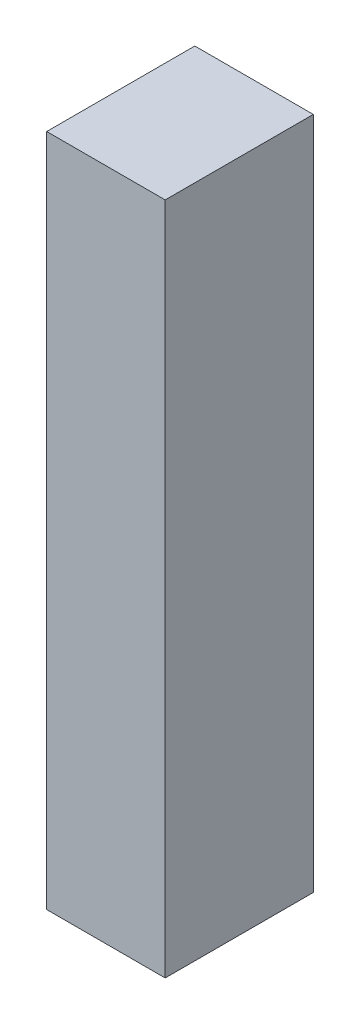
ISO-10303-21;
HEADER;
FILE_DESCRIPTION(('STEP AP214'),'2;1');
FILE_NAME('part.step','',(''),(''),'','','');
FILE_SCHEMA(('AUTOMOTIVE_DESIGN { 1 0 10303 214 1 1 1 1 }'));
ENDSEC;
DATA;
#1=APPLICATION_CONTEXT('core data for automotive mechanical design processes');
#2=APPLICATION_PROTOCOL_DEFINITION('international standard','automotive_design',2000,#1);
#3=PRODUCT_CONTEXT('',#1,'mechanical');
#4=PRODUCT('Part','Part','',(#3));
#5=PRODUCT_RELATED_PRODUCT_CATEGORY('part','',(#4));
#6=PRODUCT_DEFINITION_FORMATION('','',#4);
#7=PRODUCT_DEFINITION_CONTEXT('part definition',#1,'design');
#8=PRODUCT_DEFINITION('design','',#6,#7);
#9=PRODUCT_DEFINITION_SHAPE('','',#8);
#10=(LENGTH_UNIT() NAMED_UNIT(*) SI_UNIT(.MILLI.,.METRE.));
#11=(NAMED_UNIT(*) PLANE_ANGLE_UNIT() SI_UNIT($,.RADIAN.));
#12=(NAMED_UNIT(*) SI_UNIT($,.STERADIAN.) SOLID_ANGLE_UNIT());
#13=UNCERTAINTY_MEASURE_WITH_UNIT(LENGTH_MEASURE(1.E-05),#10,'distance_accuracy_value','');
#14=(GEOMETRIC_REPRESENTATION_CONTEXT(3) GLOBAL_UNCERTAINTY_ASSIGNED_CONTEXT((#13)) GLOBAL_UNIT_ASSIGNED_CONTEXT((#10,
#11,#12)) REPRESENTATION_CONTEXT('',''));
#15=CARTESIAN_POINT('',(0.,0.,0.));
#16=DIRECTION('',(0.,0.,1.));
#17=DIRECTION('',(1.,0.,0.));
#18=AXIS2_PLACEMENT_3D('',#15,#16,#17);
#19=CARTESIAN_POINT('',(8.,-45.5,20.));
#20=DIRECTION('',(-1.,0.,0.));
#21=DIRECTION('',(0.,0.,1.));
#22=AXIS2_PLACEMENT_3D('',#19,#20,#21);
#23=PLANE('',#22);
#24=DIRECTION('',(0.,1.,0.));
#25=VECTOR('',#24,1.);
#26=CARTESIAN_POINT('',(8.,-45.5,0.));
#27=LINE('',#26,#25);
#28=CARTESIAN_POINT('',(8.,-45.5,0.));
#29=VERTEX_POINT('',#28);
#30=CARTESIAN_POINT('',(8.,45.5,0.));
#31=VERTEX_POINT('',#30);
#32=EDGE_CURVE('E96',#29,#31,#27,.T.);
#33=ORIENTED_EDGE('',*,*,#32,.T.);
#34=DIRECTION('',(0.,0.,-1.));
#35=VECTOR('',#34,1.);
#36=CARTESIAN_POINT('',(8.,45.5,20.));
#37=LINE('',#36,#35);
#38=CARTESIAN_POINT('',(8.,45.5,20.));
#39=VERTEX_POINT('',#38);
#40=EDGE_CURVE('E11',#39,#31,#37,.T.);
#41=ORIENTED_EDGE('',*,*,#40,.F.);
#42=DIRECTION('',(0.,1.,0.));
#43=VECTOR('',#42,1.);
#44=CARTESIAN_POINT('',(8.,-45.5,20.));
#45=LINE('',#44,#43);
#46=CARTESIAN_POINT('',(8.,-45.5,20.));
#47=VERTEX_POINT('',#46);
#48=EDGE_CURVE('E84',#47,#39,#45,.T.);
#49=ORIENTED_EDGE('',*,*,#48,.F.);
#50=DIRECTION('',(0.,0.,-1.));
#51=VECTOR('',#50,1.);
#52=CARTESIAN_POINT('',(8.,-45.5,20.));
#53=LINE('',#52,#51);
#54=EDGE_CURVE('E92',#47,#29,#53,.T.);
#55=ORIENTED_EDGE('',*,*,#54,.T.);
#56=EDGE_LOOP('',(#33,#41,#49,#55));
#57=FACE_BOUND('',#56,.T.);
#58=ADVANCED_FACE('F33',(#57),#23,.F.);
#59=CARTESIAN_POINT('',(-8.,45.5,20.));
#60=DIRECTION('',(0.,-1.,0.));
#61=DIRECTION('',(0.,0.,-1.));
#62=AXIS2_PLACEMENT_3D('',#59,#60,#61);
#63=PLANE('',#62);
#64=DIRECTION('',(-1.,0.,0.));
#65=VECTOR('',#64,1.);
#66=CARTESIAN_POINT('',(-8.,45.5,0.));
#67=LINE('',#66,#65);
#68=CARTESIAN_POINT('',(-8.,45.5,0.));
#69=VERTEX_POINT('',#68);
#70=EDGE_CURVE('E88',#31,#69,#67,.T.);
#71=ORIENTED_EDGE('',*,*,#70,.T.);
#72=DIRECTION('',(0.,0.,-1.));
#73=VECTOR('',#72,1.);
#74=CARTESIAN_POINT('',(-8.,45.5,20.));
#75=LINE('',#74,#73);
#76=CARTESIAN_POINT('',(-8.,45.5,20.));
#77=VERTEX_POINT('',#76);
#78=EDGE_CURVE('E41',#77,#69,#75,.T.);
#79=ORIENTED_EDGE('',*,*,#78,.F.);
#80=DIRECTION('',(-1.,0.,0.));
#81=VECTOR('',#80,1.);
#82=CARTESIAN_POINT('',(-8.,45.5,20.));
#83=LINE('',#82,#81);
#84=EDGE_CURVE('E79',#39,#77,#83,.T.);
#85=ORIENTED_EDGE('',*,*,#84,.F.);
#86=ORIENTED_EDGE('',*,*,#40,.T.);
#87=EDGE_LOOP('',(#71,#79,#85,#86));
#88=FACE_BOUND('',#87,.T.);
#89=ADVANCED_FACE('F87',(#88),#63,.F.);
#90=CARTESIAN_POINT('',(-8.,-45.5,20.));
#91=DIRECTION('',(1.,0.,0.));
#92=DIRECTION('',(0.,0.,-1.));
#93=AXIS2_PLACEMENT_3D('',#90,#91,#92);
#94=PLANE('',#93);
#95=DIRECTION('',(0.,-1.,0.));
#96=VECTOR('',#95,1.);
#97=CARTESIAN_POINT('',(-8.,-45.5,0.));
#98=LINE('',#97,#96);
#99=CARTESIAN_POINT('',(-8.,-45.5,0.));
#100=VERTEX_POINT('',#99);
#101=EDGE_CURVE('E66',#69,#100,#98,.T.);
#102=ORIENTED_EDGE('',*,*,#101,.T.);
#103=DIRECTION('',(0.,0.,-1.));
#104=VECTOR('',#103,1.);
#105=CARTESIAN_POINT('',(-8.,-45.5,20.));
#106=LINE('',#105,#104);
#107=CARTESIAN_POINT('',(-8.,-45.5,20.));
#108=VERTEX_POINT('',#107);
#109=EDGE_CURVE('E89',#108,#100,#106,.T.);
#110=ORIENTED_EDGE('',*,*,#109,.F.);
#111=DIRECTION('',(0.,-1.,0.));
#112=VECTOR('',#111,1.);
#113=CARTESIAN_POINT('',(-8.,-45.5,20.));
#114=LINE('',#113,#112);
#115=EDGE_CURVE('E82',#77,#108,#114,.T.);
#116=ORIENTED_EDGE('',*,*,#115,.F.);
#117=ORIENTED_EDGE('',*,*,#78,.T.);
#118=EDGE_LOOP('',(#102,#110,#116,#117));
#119=FACE_BOUND('',#118,.T.);
#120=ADVANCED_FACE('F90',(#119),#94,.F.);
#121=CARTESIAN_POINT('',(-8.,-45.5,20.));
#122=DIRECTION('',(0.,1.,0.));
#123=DIRECTION('',(0.,0.,1.));
#124=AXIS2_PLACEMENT_3D('',#121,#122,#123);
#125=PLANE('',#124);
#126=DIRECTION('',(1.,0.,0.));
#127=VECTOR('',#126,1.);
#128=CARTESIAN_POINT('',(-8.,-45.5,0.));
#129=LINE('',#128,#127);
#130=EDGE_CURVE('E72',#100,#29,#129,.T.);
#131=ORIENTED_EDGE('',*,*,#130,.T.);
#132=ORIENTED_EDGE('',*,*,#54,.F.);
#133=DIRECTION('',(1.,0.,0.));
#134=VECTOR('',#133,1.);
#135=CARTESIAN_POINT('',(-8.,-45.5,20.));
#136=LINE('',#135,#134);
#137=EDGE_CURVE('E49',#108,#47,#136,.T.);
#138=ORIENTED_EDGE('',*,*,#137,.F.);
#139=ORIENTED_EDGE('',*,*,#109,.T.);
#140=EDGE_LOOP('',(#131,#132,#138,#139));
#141=FACE_BOUND('',#140,.T.);
#142=ADVANCED_FACE('F103',(#141),#125,.F.);
#143=CARTESIAN_POINT('',(0.,0.,20.));
#144=DIRECTION('',(0.,0.,-1.));
#145=DIRECTION('',(-1.,0.,0.));
#146=AXIS2_PLACEMENT_3D('',#143,#144,#145);
#147=PLANE('',#146);
#148=ORIENTED_EDGE('',*,*,#48,.T.);
#149=ORIENTED_EDGE('',*,*,#84,.T.);
#150=ORIENTED_EDGE('',*,*,#115,.T.);
#151=ORIENTED_EDGE('',*,*,#137,.T.);
#152=EDGE_LOOP('',(#148,#149,#150,#151));
#153=FACE_BOUND('',#152,.T.);
#154=ADVANCED_FACE('F80',(#153),#147,.F.);
#155=CARTESIAN_POINT('',(0.,0.,0.));
#156=DIRECTION('',(0.,0.,-1.));
#157=DIRECTION('',(-1.,0.,0.));
#158=AXIS2_PLACEMENT_3D('',#155,#156,#157);
#159=PLANE('',#158);
#160=ORIENTED_EDGE('',*,*,#32,.F.);
#161=ORIENTED_EDGE('',*,*,#130,.F.);
#162=ORIENTED_EDGE('',*,*,#101,.F.);
#163=ORIENTED_EDGE('',*,*,#70,.F.);
#164=EDGE_LOOP('',(#160,#161,#162,#163));
#165=FACE_BOUND('',#164,.T.);
#166=ADVANCED_FACE('F106',(#165),#159,.T.);
#167=CLOSED_SHELL('',(#58,#89,#120,#142,#154,#166));
#168=MANIFOLD_SOLID_BREP('B2',#167);
#169=ADVANCED_BREP_SHAPE_REPRESENTATION('',(#18,#168),#14);
#170=SHAPE_DEFINITION_REPRESENTATION(#9,#169);
ENDSEC;
END-ISO-10303-21;
